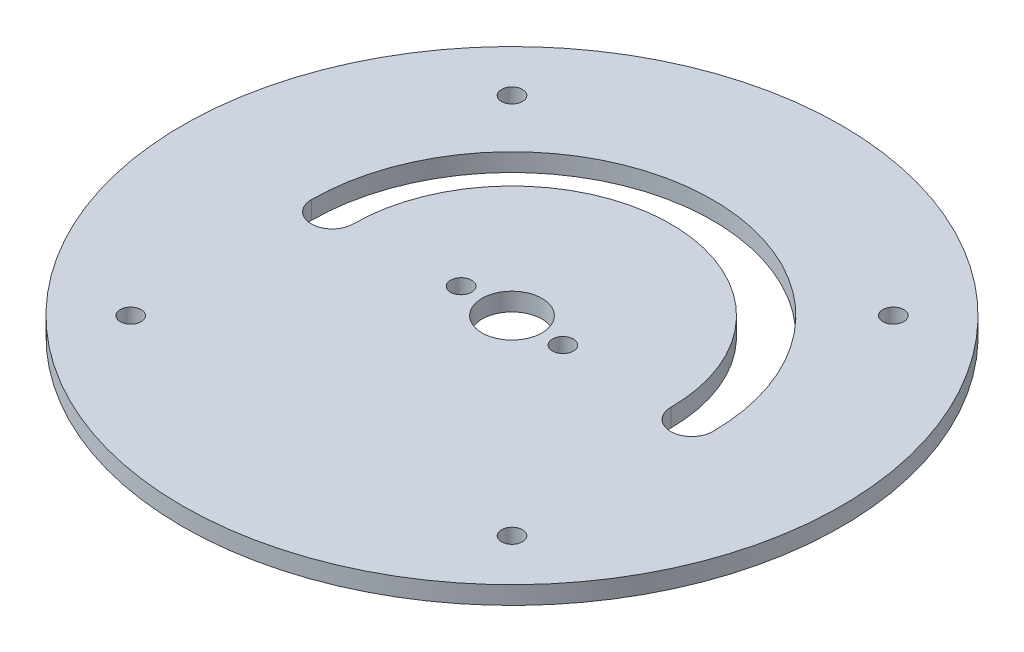
ISO-10303-21;
HEADER;
FILE_DESCRIPTION(('STEP AP214'),'2;1');
FILE_NAME('part.step','',(''),(''),'','','');
FILE_SCHEMA(('AUTOMOTIVE_DESIGN { 1 0 10303 214 1 1 1 1 }'));
ENDSEC;
DATA;
#1=APPLICATION_CONTEXT('core data for automotive mechanical design processes');
#2=APPLICATION_PROTOCOL_DEFINITION('international standard','automotive_design',2000,#1);
#3=PRODUCT_CONTEXT('',#1,'mechanical');
#4=PRODUCT('Part','Part','',(#3));
#5=PRODUCT_RELATED_PRODUCT_CATEGORY('part','',(#4));
#6=PRODUCT_DEFINITION_FORMATION('','',#4);
#7=PRODUCT_DEFINITION_CONTEXT('part definition',#1,'design');
#8=PRODUCT_DEFINITION('design','',#6,#7);
#9=PRODUCT_DEFINITION_SHAPE('','',#8);
#10=(LENGTH_UNIT() NAMED_UNIT(*) SI_UNIT(.MILLI.,.METRE.));
#11=(NAMED_UNIT(*) PLANE_ANGLE_UNIT() SI_UNIT($,.RADIAN.));
#12=(NAMED_UNIT(*) SI_UNIT($,.STERADIAN.) SOLID_ANGLE_UNIT());
#13=UNCERTAINTY_MEASURE_WITH_UNIT(LENGTH_MEASURE(1.E-05),#10,'distance_accuracy_value','');
#14=(GEOMETRIC_REPRESENTATION_CONTEXT(3) GLOBAL_UNCERTAINTY_ASSIGNED_CONTEXT((#13)) GLOBAL_UNIT_ASSIGNED_CONTEXT((#10,
#11,#12)) REPRESENTATION_CONTEXT('',''));
#15=CARTESIAN_POINT('',(0.,0.,0.));
#16=DIRECTION('',(0.,0.,1.));
#17=DIRECTION('',(1.,0.,0.));
#18=AXIS2_PLACEMENT_3D('',#15,#16,#17);
#19=CARTESIAN_POINT('',(0.,3.,0.));
#20=DIRECTION('',(0.,1.,0.));
#21=DIRECTION('',(0.,0.,1.));
#22=AXIS2_PLACEMENT_3D('',#19,#20,#21);
#23=PLANE('',#22);
#24=CARTESIAN_POINT('',(31.8198051533938,3.,31.8198051533954));
#25=DIRECTION('',(0.,1.,0.));
#26=DIRECTION('',(0.,0.,1.));
#27=AXIS2_PLACEMENT_3D('',#24,#25,#26);
#28=CIRCLE('',#27,1.75000000000001);
#29=CARTESIAN_POINT('',(31.8198051533938,3.,33.5698051533954));
#30=VERTEX_POINT('',#29);
#31=EDGE_CURVE('E168',#30,#30,#28,.T.);
#32=ORIENTED_EDGE('',*,*,#31,.F.);
#33=EDGE_LOOP('',(#32));
#34=FACE_BOUND('',#33,.T.);
#35=CARTESIAN_POINT('',(0.,3.,0.));
#36=DIRECTION('',(0.,1.,0.));
#37=DIRECTION('',(0.,0.,1.));
#38=AXIS2_PLACEMENT_3D('',#35,#36,#37);
#39=CIRCLE('',#38,33.5);
#40=CARTESIAN_POINT('',(33.5,3.,0.));
#41=VERTEX_POINT('',#40);
#42=CARTESIAN_POINT('',(-33.5,3.,0.));
#43=VERTEX_POINT('',#42);
#44=EDGE_CURVE('E88',#41,#43,#39,.T.);
#45=ORIENTED_EDGE('',*,*,#44,.F.);
#46=CARTESIAN_POINT('',(30.,3.,0.));
#47=DIRECTION('',(0.,1.,0.));
#48=DIRECTION('',(0.,0.,1.));
#49=AXIS2_PLACEMENT_3D('',#46,#47,#48);
#50=CIRCLE('',#49,3.5);
#51=CARTESIAN_POINT('',(26.5,3.,0.));
#52=VERTEX_POINT('',#51);
#53=EDGE_CURVE('E80',#52,#41,#50,.T.);
#54=ORIENTED_EDGE('',*,*,#53,.F.);
#55=CARTESIAN_POINT('',(0.,3.,0.));
#56=DIRECTION('',(0.,-1.,0.));
#57=DIRECTION('',(0.,0.,1.));
#58=AXIS2_PLACEMENT_3D('',#55,#56,#57);
#59=CIRCLE('',#58,26.5);
#60=CARTESIAN_POINT('',(-26.5,3.,0.));
#61=VERTEX_POINT('',#60);
#62=EDGE_CURVE('E103',#61,#52,#59,.T.);
#63=ORIENTED_EDGE('',*,*,#62,.F.);
#64=CARTESIAN_POINT('',(-30.,3.,0.));
#65=DIRECTION('',(0.,1.,0.));
#66=DIRECTION('',(0.,0.,1.));
#67=AXIS2_PLACEMENT_3D('',#64,#65,#66);
#68=CIRCLE('',#67,3.5);
#69=EDGE_CURVE('E101',#43,#61,#68,.T.);
#70=ORIENTED_EDGE('',*,*,#69,.F.);
#71=EDGE_LOOP('',(#45,#54,#63,#70));
#72=FACE_BOUND('',#71,.T.);
#73=CARTESIAN_POINT('',(-31.8198051533938,3.,-31.8198051533955));
#74=DIRECTION('',(0.,1.,0.));
#75=DIRECTION('',(0.,0.,1.));
#76=AXIS2_PLACEMENT_3D('',#73,#74,#75);
#77=CIRCLE('',#76,1.75);
#78=CARTESIAN_POINT('',(-31.8198051533938,3.,-30.0698051533955));
#79=VERTEX_POINT('',#78);
#80=EDGE_CURVE('E119',#79,#79,#77,.T.);
#81=ORIENTED_EDGE('',*,*,#80,.F.);
#82=EDGE_LOOP('',(#81));
#83=FACE_BOUND('',#82,.T.);
#84=CARTESIAN_POINT('',(8.5,3.,0.));
#85=DIRECTION('',(0.,1.,0.));
#86=DIRECTION('',(0.,0.,1.));
#87=AXIS2_PLACEMENT_3D('',#84,#85,#86);
#88=CIRCLE('',#87,1.75);
#89=CARTESIAN_POINT('',(8.5,3.,1.75));
#90=VERTEX_POINT('',#89);
#91=EDGE_CURVE('E131',#90,#90,#88,.T.);
#92=ORIENTED_EDGE('',*,*,#91,.F.);
#93=EDGE_LOOP('',(#92));
#94=FACE_BOUND('',#93,.T.);
#95=CARTESIAN_POINT('',(0.,3.,0.));
#96=DIRECTION('',(0.,1.,0.));
#97=DIRECTION('',(0.,0.,1.));
#98=AXIS2_PLACEMENT_3D('',#95,#96,#97);
#99=CIRCLE('',#98,55.);
#100=CARTESIAN_POINT('',(0.,3.,55.));
#101=VERTEX_POINT('',#100);
#102=EDGE_CURVE('E11',#101,#101,#99,.T.);
#103=ORIENTED_EDGE('',*,*,#102,.T.);
#104=EDGE_LOOP('',(#103));
#105=FACE_BOUND('',#104,.T.);
#106=CARTESIAN_POINT('',(0.,3.,0.));
#107=DIRECTION('',(0.,1.,0.));
#108=DIRECTION('',(0.,0.,1.));
#109=AXIS2_PLACEMENT_3D('',#106,#107,#108);
#110=CIRCLE('',#109,5.);
#111=CARTESIAN_POINT('',(0.,3.,5.));
#112=VERTEX_POINT('',#111);
#113=EDGE_CURVE('E137',#112,#112,#110,.T.);
#114=ORIENTED_EDGE('',*,*,#113,.F.);
#115=EDGE_LOOP('',(#114));
#116=FACE_BOUND('',#115,.T.);
#117=CARTESIAN_POINT('',(-8.5,3.,0.));
#118=DIRECTION('',(0.,1.,0.));
#119=DIRECTION('',(0.,0.,-1.));
#120=AXIS2_PLACEMENT_3D('',#117,#118,#119);
#121=CIRCLE('',#120,1.75);
#122=CARTESIAN_POINT('',(-8.5,3.,-1.75));
#123=VERTEX_POINT('',#122);
#124=EDGE_CURVE('E125',#123,#123,#121,.T.);
#125=ORIENTED_EDGE('',*,*,#124,.F.);
#126=EDGE_LOOP('',(#125));
#127=FACE_BOUND('',#126,.T.);
#128=CARTESIAN_POINT('',(31.8198051533955,3.,-31.8198051533939));
#129=DIRECTION('',(0.,1.,0.));
#130=DIRECTION('',(0.,0.,1.));
#131=AXIS2_PLACEMENT_3D('',#128,#129,#130);
#132=CIRCLE('',#131,1.75000000000831);
#133=CARTESIAN_POINT('',(31.8198051533955,3.,-30.0698051533856));
#134=VERTEX_POINT('',#133);
#135=EDGE_CURVE('E109',#134,#134,#132,.T.);
#136=ORIENTED_EDGE('',*,*,#135,.F.);
#137=EDGE_LOOP('',(#136));
#138=FACE_BOUND('',#137,.T.);
#139=CARTESIAN_POINT('',(-31.8198051533955,3.,31.8198051533938));
#140=DIRECTION('',(0.,1.,0.));
#141=DIRECTION('',(0.,0.,1.));
#142=AXIS2_PLACEMENT_3D('',#139,#140,#141);
#143=CIRCLE('',#142,1.75000000000001);
#144=CARTESIAN_POINT('',(-31.8198051533955,3.,33.5698051533938));
#145=VERTEX_POINT('',#144);
#146=EDGE_CURVE('E175',#145,#145,#143,.T.);
#147=ORIENTED_EDGE('',*,*,#146,.F.);
#148=EDGE_LOOP('',(#147));
#149=FACE_BOUND('',#148,.T.);
#150=ADVANCED_FACE('F39',(#34,#72,#83,#94,#105,#116,#127,#138,#149),#23,.T.);
#151=CARTESIAN_POINT('',(0.,0.,0.));
#152=DIRECTION('',(0.,1.,0.));
#153=DIRECTION('',(0.,0.,1.));
#154=AXIS2_PLACEMENT_3D('',#151,#152,#153);
#155=PLANE('',#154);
#156=CARTESIAN_POINT('',(-31.8198051533938,0.,-31.8198051533955));
#157=DIRECTION('',(0.,1.,0.));
#158=DIRECTION('',(0.,0.,1.));
#159=AXIS2_PLACEMENT_3D('',#156,#157,#158);
#160=CIRCLE('',#159,1.75);
#161=CARTESIAN_POINT('',(-31.8198051533938,0.,-30.0698051533955));
#162=VERTEX_POINT('',#161);
#163=EDGE_CURVE('E96',#162,#162,#160,.T.);
#164=ORIENTED_EDGE('',*,*,#163,.T.);
#165=EDGE_LOOP('',(#164));
#166=FACE_BOUND('',#165,.T.);
#167=CARTESIAN_POINT('',(-8.5,0.,0.));
#168=DIRECTION('',(0.,1.,0.));
#169=DIRECTION('',(0.,0.,-1.));
#170=AXIS2_PLACEMENT_3D('',#167,#168,#169);
#171=CIRCLE('',#170,1.75);
#172=CARTESIAN_POINT('',(-8.5,0.,-1.75));
#173=VERTEX_POINT('',#172);
#174=EDGE_CURVE('E122',#173,#173,#171,.T.);
#175=ORIENTED_EDGE('',*,*,#174,.T.);
#176=EDGE_LOOP('',(#175));
#177=FACE_BOUND('',#176,.T.);
#178=CARTESIAN_POINT('',(8.5,0.,0.));
#179=DIRECTION('',(0.,1.,0.));
#180=DIRECTION('',(0.,0.,1.));
#181=AXIS2_PLACEMENT_3D('',#178,#179,#180);
#182=CIRCLE('',#181,1.75);
#183=CARTESIAN_POINT('',(8.5,0.,1.75));
#184=VERTEX_POINT('',#183);
#185=EDGE_CURVE('E128',#184,#184,#182,.T.);
#186=ORIENTED_EDGE('',*,*,#185,.T.);
#187=EDGE_LOOP('',(#186));
#188=FACE_BOUND('',#187,.T.);
#189=CARTESIAN_POINT('',(0.,0.,0.));
#190=DIRECTION('',(0.,1.,0.));
#191=DIRECTION('',(0.,0.,1.));
#192=AXIS2_PLACEMENT_3D('',#189,#190,#191);
#193=CIRCLE('',#192,5.);
#194=CARTESIAN_POINT('',(0.,0.,5.));
#195=VERTEX_POINT('',#194);
#196=EDGE_CURVE('E134',#195,#195,#193,.T.);
#197=ORIENTED_EDGE('',*,*,#196,.T.);
#198=EDGE_LOOP('',(#197));
#199=FACE_BOUND('',#198,.T.);
#200=CARTESIAN_POINT('',(0.,0.,0.));
#201=DIRECTION('',(0.,1.,0.));
#202=DIRECTION('',(0.,0.,1.));
#203=AXIS2_PLACEMENT_3D('',#200,#201,#202);
#204=CIRCLE('',#203,55.);
#205=CARTESIAN_POINT('',(0.,0.,55.));
#206=VERTEX_POINT('',#205);
#207=EDGE_CURVE('E43',#206,#206,#204,.T.);
#208=ORIENTED_EDGE('',*,*,#207,.F.);
#209=EDGE_LOOP('',(#208));
#210=FACE_BOUND('',#209,.T.);
#211=CARTESIAN_POINT('',(30.,0.,0.));
#212=DIRECTION('',(0.,1.,0.));
#213=DIRECTION('',(0.,0.,1.));
#214=AXIS2_PLACEMENT_3D('',#211,#212,#213);
#215=CIRCLE('',#214,3.5);
#216=CARTESIAN_POINT('',(26.5,0.,0.));
#217=VERTEX_POINT('',#216);
#218=CARTESIAN_POINT('',(33.5,0.,0.));
#219=VERTEX_POINT('',#218);
#220=EDGE_CURVE('E62',#217,#219,#215,.T.);
#221=ORIENTED_EDGE('',*,*,#220,.T.);
#222=CARTESIAN_POINT('',(0.,0.,0.));
#223=DIRECTION('',(0.,1.,0.));
#224=DIRECTION('',(0.,0.,1.));
#225=AXIS2_PLACEMENT_3D('',#222,#223,#224);
#226=CIRCLE('',#225,33.5);
#227=CARTESIAN_POINT('',(-33.5,0.,0.));
#228=VERTEX_POINT('',#227);
#229=EDGE_CURVE('E95',#219,#228,#226,.T.);
#230=ORIENTED_EDGE('',*,*,#229,.T.);
#231=CARTESIAN_POINT('',(-30.,0.,0.));
#232=DIRECTION('',(0.,1.,0.));
#233=DIRECTION('',(0.,0.,1.));
#234=AXIS2_PLACEMENT_3D('',#231,#232,#233);
#235=CIRCLE('',#234,3.5);
#236=CARTESIAN_POINT('',(-26.5,0.,0.));
#237=VERTEX_POINT('',#236);
#238=EDGE_CURVE('E111',#228,#237,#235,.T.);
#239=ORIENTED_EDGE('',*,*,#238,.T.);
#240=CARTESIAN_POINT('',(0.,0.,0.));
#241=DIRECTION('',(0.,-1.,0.));
#242=DIRECTION('',(0.,0.,1.));
#243=AXIS2_PLACEMENT_3D('',#240,#241,#242);
#244=CIRCLE('',#243,26.5);
#245=EDGE_CURVE('E89',#237,#217,#244,.T.);
#246=ORIENTED_EDGE('',*,*,#245,.T.);
#247=EDGE_LOOP('',(#221,#230,#239,#246));
#248=FACE_BOUND('',#247,.T.);
#249=CARTESIAN_POINT('',(31.8198051533955,0.,-31.8198051533939));
#250=DIRECTION('',(0.,1.,0.));
#251=DIRECTION('',(0.,0.,1.));
#252=AXIS2_PLACEMENT_3D('',#249,#250,#251);
#253=CIRCLE('',#252,1.75000000000831);
#254=CARTESIAN_POINT('',(31.8198051533955,0.,-30.0698051533856));
#255=VERTEX_POINT('',#254);
#256=EDGE_CURVE('E170',#255,#255,#253,.T.);
#257=ORIENTED_EDGE('',*,*,#256,.T.);
#258=EDGE_LOOP('',(#257));
#259=FACE_BOUND('',#258,.T.);
#260=CARTESIAN_POINT('',(31.8198051533938,0.,31.8198051533954));
#261=DIRECTION('',(0.,1.,0.));
#262=DIRECTION('',(0.,0.,1.));
#263=AXIS2_PLACEMENT_3D('',#260,#261,#262);
#264=CIRCLE('',#263,1.75000000000001);
#265=CARTESIAN_POINT('',(31.8198051533938,0.,33.5698051533954));
#266=VERTEX_POINT('',#265);
#267=EDGE_CURVE('E171',#266,#266,#264,.T.);
#268=ORIENTED_EDGE('',*,*,#267,.T.);
#269=EDGE_LOOP('',(#268));
#270=FACE_BOUND('',#269,.T.);
#271=CARTESIAN_POINT('',(-31.8198051533955,0.,31.8198051533938));
#272=DIRECTION('',(0.,1.,0.));
#273=DIRECTION('',(0.,0.,1.));
#274=AXIS2_PLACEMENT_3D('',#271,#272,#273);
#275=CIRCLE('',#274,1.75000000000001);
#276=CARTESIAN_POINT('',(-31.8198051533955,0.,33.5698051533938));
#277=VERTEX_POINT('',#276);
#278=EDGE_CURVE('E178',#277,#277,#275,.T.);
#279=ORIENTED_EDGE('',*,*,#278,.T.);
#280=EDGE_LOOP('',(#279));
#281=FACE_BOUND('',#280,.T.);
#282=ADVANCED_FACE('F143',(#166,#177,#188,#199,#210,#248,#259,#270,#281),#155,.F.);
#283=CARTESIAN_POINT('',(0.,3.,0.));
#284=DIRECTION('',(0.,-1.,0.));
#285=DIRECTION('',(0.,0.,-1.));
#286=AXIS2_PLACEMENT_3D('',#283,#284,#285);
#287=CYLINDRICAL_SURFACE('',#286,55.);
#288=ORIENTED_EDGE('',*,*,#102,.F.);
#289=EDGE_LOOP('',(#288));
#290=FACE_BOUND('',#289,.T.);
#291=ORIENTED_EDGE('',*,*,#207,.T.);
#292=EDGE_LOOP('',(#291));
#293=FACE_BOUND('',#292,.T.);
#294=ADVANCED_FACE('F41',(#290,#293),#287,.T.);
#295=CARTESIAN_POINT('',(0.,3.,0.));
#296=DIRECTION('',(0.,-1.,0.));
#297=DIRECTION('',(0.,0.,-1.));
#298=AXIS2_PLACEMENT_3D('',#295,#296,#297);
#299=CYLINDRICAL_SURFACE('',#298,5.);
#300=ORIENTED_EDGE('',*,*,#113,.T.);
#301=EDGE_LOOP('',(#300));
#302=FACE_BOUND('',#301,.T.);
#303=ORIENTED_EDGE('',*,*,#196,.F.);
#304=EDGE_LOOP('',(#303));
#305=FACE_BOUND('',#304,.T.);
#306=ADVANCED_FACE('F146',(#302,#305),#299,.F.);
#307=CARTESIAN_POINT('',(8.5,3.,0.));
#308=DIRECTION('',(0.,-1.,0.));
#309=DIRECTION('',(0.,0.,-1.));
#310=AXIS2_PLACEMENT_3D('',#307,#308,#309);
#311=CYLINDRICAL_SURFACE('',#310,1.75);
#312=ORIENTED_EDGE('',*,*,#91,.T.);
#313=EDGE_LOOP('',(#312));
#314=FACE_BOUND('',#313,.T.);
#315=ORIENTED_EDGE('',*,*,#185,.F.);
#316=EDGE_LOOP('',(#315));
#317=FACE_BOUND('',#316,.T.);
#318=ADVANCED_FACE('F148',(#314,#317),#311,.F.);
#319=CARTESIAN_POINT('',(-8.5,3.,0.));
#320=DIRECTION('',(0.,-1.,0.));
#321=DIRECTION('',(0.,0.,-1.));
#322=AXIS2_PLACEMENT_3D('',#319,#320,#321);
#323=CYLINDRICAL_SURFACE('',#322,1.75);
#324=ORIENTED_EDGE('',*,*,#124,.T.);
#325=EDGE_LOOP('',(#324));
#326=FACE_BOUND('',#325,.T.);
#327=ORIENTED_EDGE('',*,*,#174,.F.);
#328=EDGE_LOOP('',(#327));
#329=FACE_BOUND('',#328,.T.);
#330=ADVANCED_FACE('F155',(#326,#329),#323,.F.);
#331=CARTESIAN_POINT('',(-31.8198051533938,3.,-31.8198051533955));
#332=DIRECTION('',(0.,-1.,0.));
#333=DIRECTION('',(0.,0.,-1.));
#334=AXIS2_PLACEMENT_3D('',#331,#332,#333);
#335=CYLINDRICAL_SURFACE('',#334,1.75);
#336=ORIENTED_EDGE('',*,*,#80,.T.);
#337=EDGE_LOOP('',(#336));
#338=FACE_BOUND('',#337,.T.);
#339=ORIENTED_EDGE('',*,*,#163,.F.);
#340=EDGE_LOOP('',(#339));
#341=FACE_BOUND('',#340,.T.);
#342=ADVANCED_FACE('F217',(#338,#341),#335,.F.);
#343=CARTESIAN_POINT('',(30.,3.,0.));
#344=DIRECTION('',(0.,-1.,0.));
#345=DIRECTION('',(0.,0.,-1.));
#346=AXIS2_PLACEMENT_3D('',#343,#344,#345);
#347=CYLINDRICAL_SURFACE('',#346,3.5);
#348=ORIENTED_EDGE('',*,*,#220,.F.);
#349=DIRECTION('',(0.,-1.,0.));
#350=VECTOR('',#349,1.);
#351=CARTESIAN_POINT('',(26.5,3.,0.));
#352=LINE('',#351,#350);
#353=EDGE_CURVE('E84',#52,#217,#352,.T.);
#354=ORIENTED_EDGE('',*,*,#353,.F.);
#355=ORIENTED_EDGE('',*,*,#53,.T.);
#356=DIRECTION('',(0.,-1.,0.));
#357=VECTOR('',#356,1.);
#358=CARTESIAN_POINT('',(33.5,3.,0.));
#359=LINE('',#358,#357);
#360=EDGE_CURVE('E83',#41,#219,#359,.T.);
#361=ORIENTED_EDGE('',*,*,#360,.T.);
#362=EDGE_LOOP('',(#348,#354,#355,#361));
#363=FACE_BOUND('',#362,.T.);
#364=ADVANCED_FACE('F82',(#363),#347,.F.);
#365=CARTESIAN_POINT('',(0.,3.,0.));
#366=DIRECTION('',(0.,-1.,0.));
#367=DIRECTION('',(0.,0.,-1.));
#368=AXIS2_PLACEMENT_3D('',#365,#366,#367);
#369=CYLINDRICAL_SURFACE('',#368,33.5);
#370=ORIENTED_EDGE('',*,*,#229,.F.);
#371=ORIENTED_EDGE('',*,*,#360,.F.);
#372=ORIENTED_EDGE('',*,*,#44,.T.);
#373=DIRECTION('',(0.,-1.,0.));
#374=VECTOR('',#373,1.);
#375=CARTESIAN_POINT('',(-33.5,3.,0.));
#376=LINE('',#375,#374);
#377=EDGE_CURVE('E97',#43,#228,#376,.T.);
#378=ORIENTED_EDGE('',*,*,#377,.T.);
#379=EDGE_LOOP('',(#370,#371,#372,#378));
#380=FACE_BOUND('',#379,.T.);
#381=ADVANCED_FACE('F92',(#380),#369,.F.);
#382=CARTESIAN_POINT('',(-30.,3.,0.));
#383=DIRECTION('',(0.,-1.,0.));
#384=DIRECTION('',(0.,0.,-1.));
#385=AXIS2_PLACEMENT_3D('',#382,#383,#384);
#386=CYLINDRICAL_SURFACE('',#385,3.5);
#387=ORIENTED_EDGE('',*,*,#238,.F.);
#388=ORIENTED_EDGE('',*,*,#377,.F.);
#389=ORIENTED_EDGE('',*,*,#69,.T.);
#390=DIRECTION('',(0.,-1.,0.));
#391=VECTOR('',#390,1.);
#392=CARTESIAN_POINT('',(-26.5,3.,0.));
#393=LINE('',#392,#391);
#394=EDGE_CURVE('E54',#61,#237,#393,.T.);
#395=ORIENTED_EDGE('',*,*,#394,.T.);
#396=EDGE_LOOP('',(#387,#388,#389,#395));
#397=FACE_BOUND('',#396,.T.);
#398=ADVANCED_FACE('F209',(#397),#386,.F.);
#399=CARTESIAN_POINT('',(0.,3.,0.));
#400=DIRECTION('',(0.,-1.,0.));
#401=DIRECTION('',(0.,0.,-1.));
#402=AXIS2_PLACEMENT_3D('',#399,#400,#401);
#403=CYLINDRICAL_SURFACE('',#402,26.5);
#404=ORIENTED_EDGE('',*,*,#245,.F.);
#405=ORIENTED_EDGE('',*,*,#394,.F.);
#406=ORIENTED_EDGE('',*,*,#62,.T.);
#407=ORIENTED_EDGE('',*,*,#353,.T.);
#408=EDGE_LOOP('',(#404,#405,#406,#407));
#409=FACE_BOUND('',#408,.T.);
#410=ADVANCED_FACE('F206',(#409),#403,.T.);
#411=CARTESIAN_POINT('',(31.8198051533955,3.,-31.8198051533939));
#412=DIRECTION('',(0.,-1.,0.));
#413=DIRECTION('',(0.,0.,-1.));
#414=AXIS2_PLACEMENT_3D('',#411,#412,#413);
#415=CYLINDRICAL_SURFACE('',#414,1.75000000000831);
#416=ORIENTED_EDGE('',*,*,#135,.T.);
#417=EDGE_LOOP('',(#416));
#418=FACE_BOUND('',#417,.T.);
#419=ORIENTED_EDGE('',*,*,#256,.F.);
#420=EDGE_LOOP('',(#419));
#421=FACE_BOUND('',#420,.T.);
#422=ADVANCED_FACE('F184',(#418,#421),#415,.F.);
#423=CARTESIAN_POINT('',(31.8198051533938,3.,31.8198051533954));
#424=DIRECTION('',(0.,-1.,0.));
#425=DIRECTION('',(0.,0.,-1.));
#426=AXIS2_PLACEMENT_3D('',#423,#424,#425);
#427=CYLINDRICAL_SURFACE('',#426,1.75000000000001);
#428=ORIENTED_EDGE('',*,*,#31,.T.);
#429=EDGE_LOOP('',(#428));
#430=FACE_BOUND('',#429,.T.);
#431=ORIENTED_EDGE('',*,*,#267,.F.);
#432=EDGE_LOOP('',(#431));
#433=FACE_BOUND('',#432,.T.);
#434=ADVANCED_FACE('F197',(#430,#433),#427,.F.);
#435=CARTESIAN_POINT('',(-31.8198051533955,3.,31.8198051533938));
#436=DIRECTION('',(0.,-1.,0.));
#437=DIRECTION('',(0.,0.,-1.));
#438=AXIS2_PLACEMENT_3D('',#435,#436,#437);
#439=CYLINDRICAL_SURFACE('',#438,1.75000000000001);
#440=ORIENTED_EDGE('',*,*,#146,.T.);
#441=EDGE_LOOP('',(#440));
#442=FACE_BOUND('',#441,.T.);
#443=ORIENTED_EDGE('',*,*,#278,.F.);
#444=EDGE_LOOP('',(#443));
#445=FACE_BOUND('',#444,.T.);
#446=ADVANCED_FACE('F195',(#442,#445),#439,.F.);
#447=CLOSED_SHELL('',(#150,#282,#294,#306,#318,#330,#342,#364,#381,#398,#410,#422,#434,#446));
#448=MANIFOLD_SOLID_BREP('B2',#447);
#449=ADVANCED_BREP_SHAPE_REPRESENTATION('',(#18,#448),#14);
#450=SHAPE_DEFINITION_REPRESENTATION(#9,#449);
ENDSEC;
END-ISO-10303-21;
